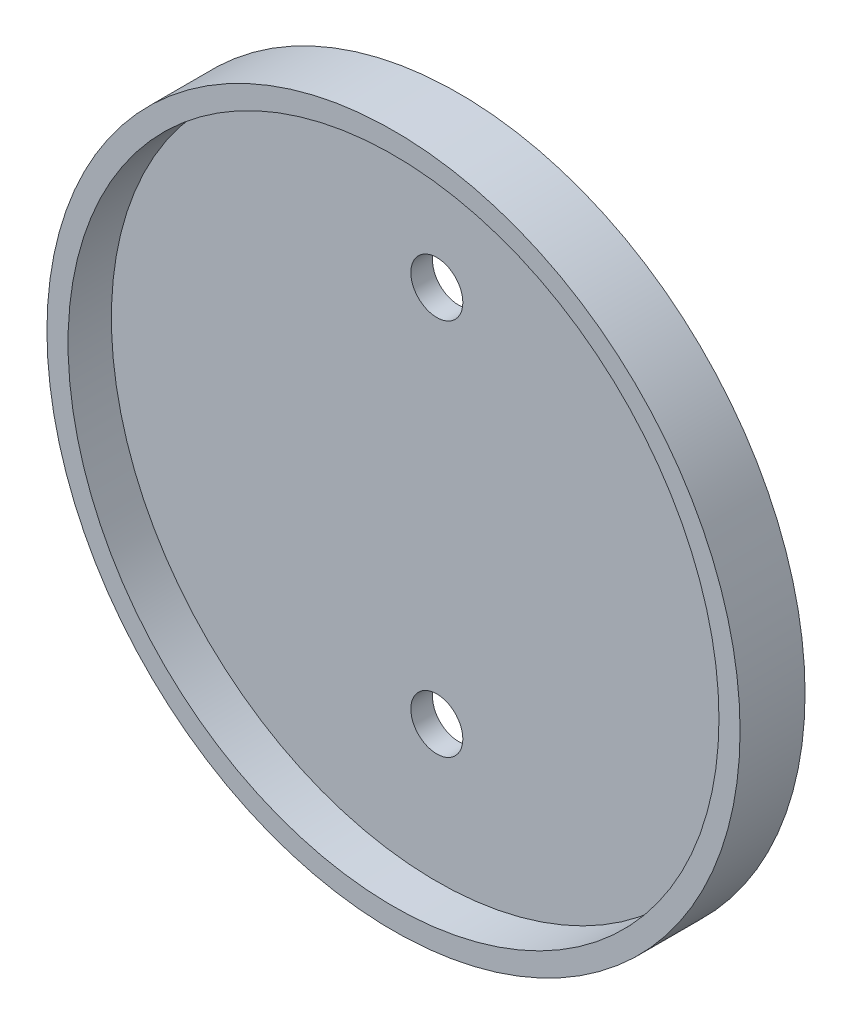
ISO-10303-21;
HEADER;
FILE_DESCRIPTION(('STEP AP214'),'2;1');
FILE_NAME('part.step','',(''),(''),'','','');
FILE_SCHEMA(('AUTOMOTIVE_DESIGN { 1 0 10303 214 1 1 1 1 }'));
ENDSEC;
DATA;
#1=APPLICATION_CONTEXT('core data for automotive mechanical design processes');
#2=APPLICATION_PROTOCOL_DEFINITION('international standard','automotive_design',2000,#1);
#3=PRODUCT_CONTEXT('',#1,'mechanical');
#4=PRODUCT('Part','Part','',(#3));
#5=PRODUCT_RELATED_PRODUCT_CATEGORY('part','',(#4));
#6=PRODUCT_DEFINITION_FORMATION('','',#4);
#7=PRODUCT_DEFINITION_CONTEXT('part definition',#1,'design');
#8=PRODUCT_DEFINITION('design','',#6,#7);
#9=PRODUCT_DEFINITION_SHAPE('','',#8);
#10=(LENGTH_UNIT() NAMED_UNIT(*) SI_UNIT(.MILLI.,.METRE.));
#11=(NAMED_UNIT(*) PLANE_ANGLE_UNIT() SI_UNIT($,.RADIAN.));
#12=(NAMED_UNIT(*) SI_UNIT($,.STERADIAN.) SOLID_ANGLE_UNIT());
#13=UNCERTAINTY_MEASURE_WITH_UNIT(LENGTH_MEASURE(1.E-05),#10,'distance_accuracy_value','');
#14=(GEOMETRIC_REPRESENTATION_CONTEXT(3) GLOBAL_UNCERTAINTY_ASSIGNED_CONTEXT((#13)) GLOBAL_UNIT_ASSIGNED_CONTEXT((#10,
#11,#12)) REPRESENTATION_CONTEXT('',''));
#15=CARTESIAN_POINT('',(0.,0.,0.));
#16=DIRECTION('',(0.,0.,1.));
#17=DIRECTION('',(1.,0.,0.));
#18=AXIS2_PLACEMENT_3D('',#15,#16,#17);
#19=CARTESIAN_POINT('',(0.,0.,-0.999998));
#20=DIRECTION('',(0.,0.,1.));
#21=DIRECTION('',(1.,0.,0.));
#22=AXIS2_PLACEMENT_3D('',#19,#20,#21);
#23=PLANE('',#22);
#24=CARTESIAN_POINT('',(0.,0.,-0.999998));
#25=DIRECTION('',(0.,0.,1.));
#26=DIRECTION('',(1.,0.,0.));
#27=AXIS2_PLACEMENT_3D('',#24,#25,#26);
#28=CIRCLE('',#27,32.);
#29=CARTESIAN_POINT('',(32.,0.,-0.999998));
#30=VERTEX_POINT('',#29);
#31=EDGE_CURVE('E41',#30,#30,#28,.T.);
#32=ORIENTED_EDGE('',*,*,#31,.F.);
#33=EDGE_LOOP('',(#32));
#34=FACE_BOUND('',#33,.T.);
#35=CARTESIAN_POINT('',(0.,17.4498,-0.999998000000001));
#36=DIRECTION('',(0.,0.,-1.));
#37=DIRECTION('',(-1.,0.,0.));
#38=AXIS2_PLACEMENT_3D('',#35,#36,#37);
#39=CIRCLE('',#38,2.39999999999999);
#40=CARTESIAN_POINT('',(-2.39999999999998,17.4498,-0.999998000000001));
#41=VERTEX_POINT('',#40);
#42=EDGE_CURVE('E57',#41,#41,#39,.T.);
#43=ORIENTED_EDGE('',*,*,#42,.F.);
#44=EDGE_LOOP('',(#43));
#45=FACE_BOUND('',#44,.T.);
#46=CARTESIAN_POINT('',(0.,-17.4498,-0.999998000000001));
#47=DIRECTION('',(0.,0.,-1.));
#48=DIRECTION('',(-1.,0.,0.));
#49=AXIS2_PLACEMENT_3D('',#46,#47,#48);
#50=CIRCLE('',#49,2.39999999999999);
#51=CARTESIAN_POINT('',(-2.39999999999999,-17.4498,-0.999998000000001));
#52=VERTEX_POINT('',#51);
#53=EDGE_CURVE('E63',#52,#52,#50,.T.);
#54=ORIENTED_EDGE('',*,*,#53,.F.);
#55=EDGE_LOOP('',(#54));
#56=FACE_BOUND('',#55,.T.);
#57=ADVANCED_FACE('F34',(#34,#45,#56),#23,.F.);
#58=CARTESIAN_POINT('',(0.,0.,0.999998));
#59=DIRECTION('',(0.,0.,-1.));
#60=DIRECTION('',(-1.,0.,0.));
#61=AXIS2_PLACEMENT_3D('',#58,#59,#60);
#62=CYLINDRICAL_SURFACE('',#61,32.);
#63=ORIENTED_EDGE('',*,*,#31,.T.);
#64=EDGE_LOOP('',(#63));
#65=FACE_BOUND('',#64,.T.);
#66=CARTESIAN_POINT('',(0.,0.,4.999998));
#67=DIRECTION('',(0.,0.,1.));
#68=DIRECTION('',(1.,0.,0.));
#69=AXIS2_PLACEMENT_3D('',#66,#67,#68);
#70=CIRCLE('',#69,32.);
#71=CARTESIAN_POINT('',(32.,0.,4.999998));
#72=VERTEX_POINT('',#71);
#73=EDGE_CURVE('E45',#72,#72,#70,.T.);
#74=ORIENTED_EDGE('',*,*,#73,.F.);
#75=EDGE_LOOP('',(#74));
#76=FACE_BOUND('',#75,.T.);
#77=ADVANCED_FACE('F36',(#65,#76),#62,.T.);
#78=CARTESIAN_POINT('',(0.,0.,4.999998));
#79=DIRECTION('',(0.,0.,1.));
#80=DIRECTION('',(1.,0.,0.));
#81=AXIS2_PLACEMENT_3D('',#78,#79,#80);
#82=PLANE('',#81);
#83=ORIENTED_EDGE('',*,*,#73,.T.);
#84=EDGE_LOOP('',(#83));
#85=FACE_BOUND('',#84,.T.);
#86=CARTESIAN_POINT('',(0.,0.,4.999998));
#87=DIRECTION('',(0.,0.,1.));
#88=DIRECTION('',(1.,0.,0.));
#89=AXIS2_PLACEMENT_3D('',#86,#87,#88);
#90=CIRCLE('',#89,30.05);
#91=CARTESIAN_POINT('',(30.05,0.,4.999998));
#92=VERTEX_POINT('',#91);
#93=EDGE_CURVE('E49',#92,#92,#90,.T.);
#94=ORIENTED_EDGE('',*,*,#93,.F.);
#95=EDGE_LOOP('',(#94));
#96=FACE_BOUND('',#95,.T.);
#97=ADVANCED_FACE('F75',(#85,#96),#82,.T.);
#98=CARTESIAN_POINT('',(0.,0.,4.999998));
#99=DIRECTION('',(0.,0.,-1.));
#100=DIRECTION('',(-1.,0.,0.));
#101=AXIS2_PLACEMENT_3D('',#98,#99,#100);
#102=CYLINDRICAL_SURFACE('',#101,30.05);
#103=ORIENTED_EDGE('',*,*,#93,.T.);
#104=EDGE_LOOP('',(#103));
#105=FACE_BOUND('',#104,.T.);
#106=CARTESIAN_POINT('',(0.,0.,0.999998));
#107=DIRECTION('',(0.,0.,1.));
#108=DIRECTION('',(1.,0.,0.));
#109=AXIS2_PLACEMENT_3D('',#106,#107,#108);
#110=CIRCLE('',#109,30.05);
#111=CARTESIAN_POINT('',(30.05,0.,0.999998));
#112=VERTEX_POINT('',#111);
#113=EDGE_CURVE('E10',#112,#112,#110,.F.);
#114=ORIENTED_EDGE('',*,*,#113,.T.);
#115=EDGE_LOOP('',(#114));
#116=FACE_BOUND('',#115,.T.);
#117=ADVANCED_FACE('F82',(#105,#116),#102,.F.);
#118=CARTESIAN_POINT('',(0.,0.,0.999998));
#119=DIRECTION('',(0.,0.,1.));
#120=DIRECTION('',(1.,0.,0.));
#121=AXIS2_PLACEMENT_3D('',#118,#119,#120);
#122=PLANE('',#121);
#123=CARTESIAN_POINT('',(0.,-17.4498,0.999998));
#124=DIRECTION('',(0.,0.,1.));
#125=DIRECTION('',(1.,0.,0.));
#126=AXIS2_PLACEMENT_3D('',#123,#124,#125);
#127=CIRCLE('',#126,2.39999999999999);
#128=CARTESIAN_POINT('',(2.39999999999999,-17.4498,0.999998));
#129=VERTEX_POINT('',#128);
#130=EDGE_CURVE('E60',#129,#129,#127,.T.);
#131=ORIENTED_EDGE('',*,*,#130,.F.);
#132=EDGE_LOOP('',(#131));
#133=FACE_BOUND('',#132,.T.);
#134=CARTESIAN_POINT('',(0.,17.4498,0.999998));
#135=DIRECTION('',(0.,0.,1.));
#136=DIRECTION('',(1.,0.,0.));
#137=AXIS2_PLACEMENT_3D('',#134,#135,#136);
#138=CIRCLE('',#137,2.39999999999999);
#139=CARTESIAN_POINT('',(2.4,17.4498,0.999998));
#140=VERTEX_POINT('',#139);
#141=EDGE_CURVE('E54',#140,#140,#138,.T.);
#142=ORIENTED_EDGE('',*,*,#141,.F.);
#143=EDGE_LOOP('',(#142));
#144=FACE_BOUND('',#143,.T.);
#145=ORIENTED_EDGE('',*,*,#113,.F.);
#146=EDGE_LOOP('',(#145));
#147=FACE_BOUND('',#146,.T.);
#148=ADVANCED_FACE('F78',(#133,#144,#147),#122,.T.);
#149=CARTESIAN_POINT('',(0.,17.4498,-0.999998));
#150=DIRECTION('',(0.,0.,-1.));
#151=DIRECTION('',(-1.,0.,0.));
#152=AXIS2_PLACEMENT_3D('',#149,#150,#151);
#153=CYLINDRICAL_SURFACE('',#152,2.39999999999999);
#154=ORIENTED_EDGE('',*,*,#42,.T.);
#155=EDGE_LOOP('',(#154));
#156=FACE_BOUND('',#155,.T.);
#157=ORIENTED_EDGE('',*,*,#141,.T.);
#158=EDGE_LOOP('',(#157));
#159=FACE_BOUND('',#158,.T.);
#160=ADVANCED_FACE('F81',(#156,#159),#153,.F.);
#161=CARTESIAN_POINT('',(0.,-17.4498,-0.999998));
#162=DIRECTION('',(0.,0.,-1.));
#163=DIRECTION('',(-1.,0.,0.));
#164=AXIS2_PLACEMENT_3D('',#161,#162,#163);
#165=CYLINDRICAL_SURFACE('',#164,2.39999999999999);
#166=ORIENTED_EDGE('',*,*,#53,.T.);
#167=EDGE_LOOP('',(#166));
#168=FACE_BOUND('',#167,.T.);
#169=ORIENTED_EDGE('',*,*,#130,.T.);
#170=EDGE_LOOP('',(#169));
#171=FACE_BOUND('',#170,.T.);
#172=ADVANCED_FACE('F67',(#168,#171),#165,.F.);
#173=CLOSED_SHELL('',(#57,#77,#97,#117,#148,#160,#172));
#174=MANIFOLD_SOLID_BREP('B2',#173);
#175=ADVANCED_BREP_SHAPE_REPRESENTATION('',(#18,#174),#14);
#176=SHAPE_DEFINITION_REPRESENTATION(#9,#175);
ENDSEC;
END-ISO-10303-21;
